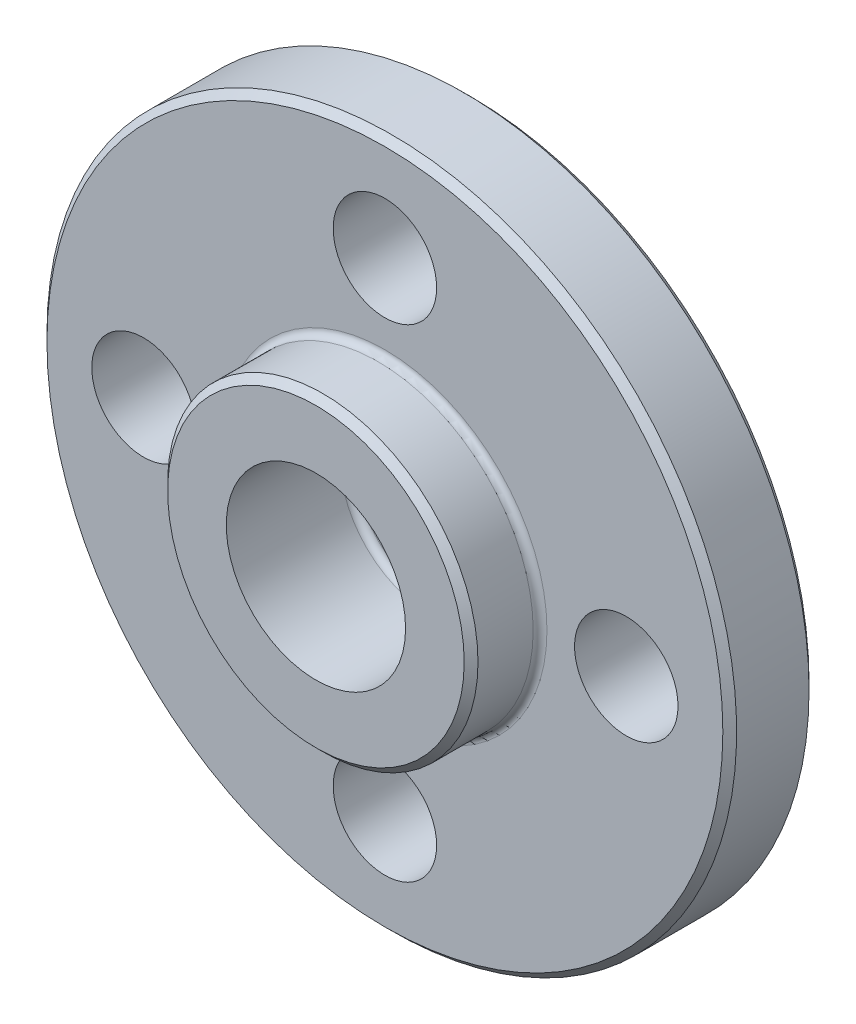
ISO-10303-21;
HEADER;
FILE_DESCRIPTION(('STEP AP214'),'2;1');
FILE_NAME('part.step','',(''),(''),'','','');
FILE_SCHEMA(('AUTOMOTIVE_DESIGN { 1 0 10303 214 1 1 1 1 }'));
ENDSEC;
DATA;
#1=APPLICATION_CONTEXT('core data for automotive mechanical design processes');
#2=APPLICATION_PROTOCOL_DEFINITION('international standard','automotive_design',2000,#1);
#3=PRODUCT_CONTEXT('',#1,'mechanical');
#4=PRODUCT('Part','Part','',(#3));
#5=PRODUCT_RELATED_PRODUCT_CATEGORY('part','',(#4));
#6=PRODUCT_DEFINITION_FORMATION('','',#4);
#7=PRODUCT_DEFINITION_CONTEXT('part definition',#1,'design');
#8=PRODUCT_DEFINITION('design','',#6,#7);
#9=PRODUCT_DEFINITION_SHAPE('','',#8);
#10=(LENGTH_UNIT() NAMED_UNIT(*) SI_UNIT(.MILLI.,.METRE.));
#11=(NAMED_UNIT(*) PLANE_ANGLE_UNIT() SI_UNIT($,.RADIAN.));
#12=(NAMED_UNIT(*) SI_UNIT($,.STERADIAN.) SOLID_ANGLE_UNIT());
#13=UNCERTAINTY_MEASURE_WITH_UNIT(LENGTH_MEASURE(1.E-05),#10,'distance_accuracy_value','');
#14=(GEOMETRIC_REPRESENTATION_CONTEXT(3) GLOBAL_UNCERTAINTY_ASSIGNED_CONTEXT((#13)) GLOBAL_UNIT_ASSIGNED_CONTEXT((#10,
#11,#12)) REPRESENTATION_CONTEXT('',''));
#15=CARTESIAN_POINT('',(0.,0.,0.));
#16=DIRECTION('',(0.,0.,1.));
#17=DIRECTION('',(1.,0.,0.));
#18=AXIS2_PLACEMENT_3D('',#15,#16,#17);
#19=CARTESIAN_POINT('',(0.,0.,2.5));
#20=DIRECTION('',(0.,0.,-1.));
#21=DIRECTION('',(-1.,0.,0.));
#22=AXIS2_PLACEMENT_3D('',#19,#20,#21);
#23=CYLINDRICAL_SURFACE('',#22,1.5);
#24=CARTESIAN_POINT('',(0.,0.,0.));
#25=DIRECTION('',(0.,0.,1.));
#26=DIRECTION('',(1.,0.,0.));
#27=AXIS2_PLACEMENT_3D('',#24,#25,#26);
#28=CIRCLE('',#27,1.5);
#29=CARTESIAN_POINT('',(1.5,0.,0.));
#30=VERTEX_POINT('',#29);
#31=EDGE_CURVE('E74',#30,#30,#28,.T.);
#32=ORIENTED_EDGE('',*,*,#31,.F.);
#33=EDGE_LOOP('',(#32));
#34=FACE_BOUND('',#33,.T.);
#35=CARTESIAN_POINT('',(0.,0.,1.));
#36=DIRECTION('',(0.,0.,1.));
#37=DIRECTION('',(1.,0.,0.));
#38=AXIS2_PLACEMENT_3D('',#35,#36,#37);
#39=CIRCLE('',#38,1.5);
#40=CARTESIAN_POINT('',(1.5,0.,1.));
#41=VERTEX_POINT('',#40);
#42=EDGE_CURVE('E71',#41,#41,#39,.T.);
#43=ORIENTED_EDGE('',*,*,#42,.T.);
#44=EDGE_LOOP('',(#43));
#45=FACE_BOUND('',#44,.T.);
#46=ADVANCED_FACE('F32',(#34,#45),#23,.F.);
#47=CARTESIAN_POINT('',(0.,0.,2.5));
#48=DIRECTION('',(0.,0.,1.));
#49=DIRECTION('',(1.,0.,0.));
#50=AXIS2_PLACEMENT_3D('',#47,#48,#49);
#51=PLANE('',#50);
#52=CARTESIAN_POINT('',(0.,0.,2.5));
#53=DIRECTION('',(0.,0.,1.));
#54=DIRECTION('',(1.,0.,0.));
#55=AXIS2_PLACEMENT_3D('',#52,#53,#54);
#56=CIRCLE('',#55,4.7);
#57=CARTESIAN_POINT('',(4.7,0.,2.5));
#58=VERTEX_POINT('',#57);
#59=EDGE_CURVE('E10',#58,#58,#56,.F.);
#60=ORIENTED_EDGE('',*,*,#59,.T.);
#61=EDGE_LOOP('',(#60));
#62=FACE_BOUND('',#61,.T.);
#63=CARTESIAN_POINT('',(0.,0.,2.5));
#64=DIRECTION('',(0.,0.,1.));
#65=DIRECTION('',(1.,0.,0.));
#66=AXIS2_PLACEMENT_3D('',#63,#64,#65);
#67=CIRCLE('',#66,9.8);
#68=CARTESIAN_POINT('',(-9.8,0.,2.5));
#69=VERTEX_POINT('',#68);
#70=EDGE_CURVE('E52',#69,#69,#67,.T.);
#71=ORIENTED_EDGE('',*,*,#70,.T.);
#72=EDGE_LOOP('',(#71));
#73=FACE_BOUND('',#72,.T.);
#74=CARTESIAN_POINT('',(0.,-7.,2.5));
#75=DIRECTION('',(0.,0.,1.));
#76=DIRECTION('',(1.,0.,0.));
#77=AXIS2_PLACEMENT_3D('',#74,#75,#76);
#78=CIRCLE('',#77,1.5);
#79=CARTESIAN_POINT('',(1.5,-7.,2.5));
#80=VERTEX_POINT('',#79);
#81=EDGE_CURVE('E85',#80,#80,#78,.T.);
#82=ORIENTED_EDGE('',*,*,#81,.F.);
#83=EDGE_LOOP('',(#82));
#84=FACE_BOUND('',#83,.T.);
#85=CARTESIAN_POINT('',(0.,7.,2.5));
#86=DIRECTION('',(0.,0.,1.));
#87=DIRECTION('',(1.,0.,0.));
#88=AXIS2_PLACEMENT_3D('',#85,#86,#87);
#89=CIRCLE('',#88,1.5);
#90=CARTESIAN_POINT('',(1.5,7.,2.5));
#91=VERTEX_POINT('',#90);
#92=EDGE_CURVE('E70',#91,#91,#89,.T.);
#93=ORIENTED_EDGE('',*,*,#92,.F.);
#94=EDGE_LOOP('',(#93));
#95=FACE_BOUND('',#94,.T.);
#96=CARTESIAN_POINT('',(7.,0.,2.5));
#97=DIRECTION('',(0.,0.,1.));
#98=DIRECTION('',(1.,0.,0.));
#99=AXIS2_PLACEMENT_3D('',#96,#97,#98);
#100=CIRCLE('',#99,1.5);
#101=CARTESIAN_POINT('',(8.5,0.,2.5));
#102=VERTEX_POINT('',#101);
#103=EDGE_CURVE('E79',#102,#102,#100,.T.);
#104=ORIENTED_EDGE('',*,*,#103,.F.);
#105=EDGE_LOOP('',(#104));
#106=FACE_BOUND('',#105,.T.);
#107=CARTESIAN_POINT('',(-7.,0.,2.5));
#108=DIRECTION('',(0.,0.,1.));
#109=DIRECTION('',(1.,0.,0.));
#110=AXIS2_PLACEMENT_3D('',#107,#108,#109);
#111=CIRCLE('',#110,1.5);
#112=CARTESIAN_POINT('',(-5.5,0.,2.5));
#113=VERTEX_POINT('',#112);
#114=EDGE_CURVE('E91',#113,#113,#111,.T.);
#115=ORIENTED_EDGE('',*,*,#114,.F.);
#116=EDGE_LOOP('',(#115));
#117=FACE_BOUND('',#116,.T.);
#118=ADVANCED_FACE('F121',(#62,#73,#84,#95,#106,#117),#51,.T.);
#119=CARTESIAN_POINT('',(0.,0.,0.));
#120=DIRECTION('',(0.,0.,1.));
#121=DIRECTION('',(1.,0.,0.));
#122=AXIS2_PLACEMENT_3D('',#119,#120,#121);
#123=PLANE('',#122);
#124=CARTESIAN_POINT('',(0.,0.,0.));
#125=DIRECTION('',(0.,0.,1.));
#126=DIRECTION('',(1.,0.,0.));
#127=AXIS2_PLACEMENT_3D('',#124,#125,#126);
#128=CIRCLE('',#127,9.8);
#129=CARTESIAN_POINT('',(9.8,0.,0.));
#130=VERTEX_POINT('',#129);
#131=EDGE_CURVE('E55',#130,#130,#128,.F.);
#132=ORIENTED_EDGE('',*,*,#131,.T.);
#133=EDGE_LOOP('',(#132));
#134=FACE_BOUND('',#133,.T.);
#135=CARTESIAN_POINT('',(-7.,0.,0.));
#136=DIRECTION('',(0.,0.,1.));
#137=DIRECTION('',(1.,0.,0.));
#138=AXIS2_PLACEMENT_3D('',#135,#136,#137);
#139=CIRCLE('',#138,1.5);
#140=CARTESIAN_POINT('',(-5.5,0.,0.));
#141=VERTEX_POINT('',#140);
#142=EDGE_CURVE('E94',#141,#141,#139,.T.);
#143=ORIENTED_EDGE('',*,*,#142,.T.);
#144=EDGE_LOOP('',(#143));
#145=FACE_BOUND('',#144,.T.);
#146=CARTESIAN_POINT('',(7.,0.,0.));
#147=DIRECTION('',(0.,0.,1.));
#148=DIRECTION('',(1.,0.,0.));
#149=AXIS2_PLACEMENT_3D('',#146,#147,#148);
#150=CIRCLE('',#149,1.5);
#151=CARTESIAN_POINT('',(8.5,0.,0.));
#152=VERTEX_POINT('',#151);
#153=EDGE_CURVE('E82',#152,#152,#150,.T.);
#154=ORIENTED_EDGE('',*,*,#153,.T.);
#155=EDGE_LOOP('',(#154));
#156=FACE_BOUND('',#155,.T.);
#157=CARTESIAN_POINT('',(0.,7.,0.));
#158=DIRECTION('',(0.,0.,1.));
#159=DIRECTION('',(1.,0.,0.));
#160=AXIS2_PLACEMENT_3D('',#157,#158,#159);
#161=CIRCLE('',#160,1.5);
#162=CARTESIAN_POINT('',(1.5,7.,0.));
#163=VERTEX_POINT('',#162);
#164=EDGE_CURVE('E76',#163,#163,#161,.T.);
#165=ORIENTED_EDGE('',*,*,#164,.T.);
#166=EDGE_LOOP('',(#165));
#167=FACE_BOUND('',#166,.T.);
#168=CARTESIAN_POINT('',(0.,-7.,0.));
#169=DIRECTION('',(0.,0.,1.));
#170=DIRECTION('',(1.,0.,0.));
#171=AXIS2_PLACEMENT_3D('',#168,#169,#170);
#172=CIRCLE('',#171,1.5);
#173=CARTESIAN_POINT('',(1.5,-7.,0.));
#174=VERTEX_POINT('',#173);
#175=EDGE_CURVE('E88',#174,#174,#172,.T.);
#176=ORIENTED_EDGE('',*,*,#175,.T.);
#177=EDGE_LOOP('',(#176));
#178=FACE_BOUND('',#177,.T.);
#179=ORIENTED_EDGE('',*,*,#31,.T.);
#180=EDGE_LOOP('',(#179));
#181=FACE_BOUND('',#180,.T.);
#182=ADVANCED_FACE('F127',(#134,#145,#156,#167,#178,#181),#123,.F.);
#183=CARTESIAN_POINT('',(0.,0.,2.5));
#184=DIRECTION('',(0.,0.,-1.));
#185=DIRECTION('',(-1.,0.,0.));
#186=AXIS2_PLACEMENT_3D('',#183,#184,#185);
#187=CYLINDRICAL_SURFACE('',#186,10.);
#188=CARTESIAN_POINT('',(0.,0.,0.200000000000002));
#189=DIRECTION('',(0.,0.,1.));
#190=DIRECTION('',(1.,0.,0.));
#191=AXIS2_PLACEMENT_3D('',#188,#189,#190);
#192=CIRCLE('',#191,10.);
#193=CARTESIAN_POINT('',(10.,0.,0.200000000000002));
#194=VERTEX_POINT('',#193);
#195=EDGE_CURVE('E58',#194,#194,#192,.T.);
#196=ORIENTED_EDGE('',*,*,#195,.T.);
#197=EDGE_LOOP('',(#196));
#198=FACE_BOUND('',#197,.T.);
#199=CARTESIAN_POINT('',(0.,0.,2.30000000000001));
#200=DIRECTION('',(0.,0.,1.));
#201=DIRECTION('',(1.,0.,0.));
#202=AXIS2_PLACEMENT_3D('',#199,#200,#201);
#203=CIRCLE('',#202,10.);
#204=CARTESIAN_POINT('',(-10.,0.,2.30000000000001));
#205=VERTEX_POINT('',#204);
#206=EDGE_CURVE('E61',#205,#205,#203,.F.);
#207=ORIENTED_EDGE('',*,*,#206,.T.);
#208=EDGE_LOOP('',(#207));
#209=FACE_BOUND('',#208,.T.);
#210=ADVANCED_FACE('F145',(#198,#209),#187,.T.);
#211=CARTESIAN_POINT('',(0.,7.,2.5));
#212=DIRECTION('',(0.,0.,-1.));
#213=DIRECTION('',(-1.,0.,0.));
#214=AXIS2_PLACEMENT_3D('',#211,#212,#213);
#215=CYLINDRICAL_SURFACE('',#214,1.5);
#216=ORIENTED_EDGE('',*,*,#92,.T.);
#217=EDGE_LOOP('',(#216));
#218=FACE_BOUND('',#217,.T.);
#219=ORIENTED_EDGE('',*,*,#164,.F.);
#220=EDGE_LOOP('',(#219));
#221=FACE_BOUND('',#220,.T.);
#222=ADVANCED_FACE('F142',(#218,#221),#215,.F.);
#223=CARTESIAN_POINT('',(7.,0.,2.5));
#224=DIRECTION('',(0.,0.,-1.));
#225=DIRECTION('',(-1.,0.,0.));
#226=AXIS2_PLACEMENT_3D('',#223,#224,#225);
#227=CYLINDRICAL_SURFACE('',#226,1.5);
#228=ORIENTED_EDGE('',*,*,#103,.T.);
#229=EDGE_LOOP('',(#228));
#230=FACE_BOUND('',#229,.T.);
#231=ORIENTED_EDGE('',*,*,#153,.F.);
#232=EDGE_LOOP('',(#231));
#233=FACE_BOUND('',#232,.T.);
#234=ADVANCED_FACE('F138',(#230,#233),#227,.F.);
#235=CARTESIAN_POINT('',(0.,-7.,2.5));
#236=DIRECTION('',(0.,0.,-1.));
#237=DIRECTION('',(-1.,0.,0.));
#238=AXIS2_PLACEMENT_3D('',#235,#236,#237);
#239=CYLINDRICAL_SURFACE('',#238,1.5);
#240=ORIENTED_EDGE('',*,*,#81,.T.);
#241=EDGE_LOOP('',(#240));
#242=FACE_BOUND('',#241,.T.);
#243=ORIENTED_EDGE('',*,*,#175,.F.);
#244=EDGE_LOOP('',(#243));
#245=FACE_BOUND('',#244,.T.);
#246=ADVANCED_FACE('F134',(#242,#245),#239,.F.);
#247=CARTESIAN_POINT('',(-7.,0.,2.5));
#248=DIRECTION('',(0.,0.,-1.));
#249=DIRECTION('',(-1.,0.,0.));
#250=AXIS2_PLACEMENT_3D('',#247,#248,#249);
#251=CYLINDRICAL_SURFACE('',#250,1.5);
#252=ORIENTED_EDGE('',*,*,#114,.T.);
#253=EDGE_LOOP('',(#252));
#254=FACE_BOUND('',#253,.T.);
#255=ORIENTED_EDGE('',*,*,#142,.F.);
#256=EDGE_LOOP('',(#255));
#257=FACE_BOUND('',#256,.T.);
#258=ADVANCED_FACE('F118',(#254,#257),#251,.F.);
#259=CARTESIAN_POINT('',(0.,0.,4.5));
#260=DIRECTION('',(0.,0.,-1.));
#261=DIRECTION('',(-1.,0.,0.));
#262=AXIS2_PLACEMENT_3D('',#259,#260,#261);
#263=CYLINDRICAL_SURFACE('',#262,4.5);
#264=CARTESIAN_POINT('',(0.,0.,2.7));
#265=DIRECTION('',(0.,0.,1.));
#266=DIRECTION('',(1.,0.,0.));
#267=AXIS2_PLACEMENT_3D('',#264,#265,#266);
#268=CIRCLE('',#267,4.5);
#269=CARTESIAN_POINT('',(4.5,0.,2.7));
#270=VERTEX_POINT('',#269);
#271=EDGE_CURVE('E39',#270,#270,#268,.T.);
#272=ORIENTED_EDGE('',*,*,#271,.T.);
#273=EDGE_LOOP('',(#272));
#274=FACE_BOUND('',#273,.T.);
#275=CARTESIAN_POINT('',(0.,0.,4.3));
#276=DIRECTION('',(0.,0.,1.));
#277=DIRECTION('',(1.,0.,0.));
#278=AXIS2_PLACEMENT_3D('',#275,#276,#277);
#279=CIRCLE('',#278,4.5);
#280=CARTESIAN_POINT('',(4.5,0.,4.3));
#281=VERTEX_POINT('',#280);
#282=EDGE_CURVE('E64',#281,#281,#279,.F.);
#283=ORIENTED_EDGE('',*,*,#282,.T.);
#284=EDGE_LOOP('',(#283));
#285=FACE_BOUND('',#284,.T.);
#286=ADVANCED_FACE('F108',(#274,#285),#263,.T.);
#287=CARTESIAN_POINT('',(0.,0.,4.5));
#288=DIRECTION('',(0.,0.,1.));
#289=DIRECTION('',(1.,0.,0.));
#290=AXIS2_PLACEMENT_3D('',#287,#288,#289);
#291=PLANE('',#290);
#292=CARTESIAN_POINT('',(0.,0.,4.5));
#293=DIRECTION('',(0.,0.,1.));
#294=DIRECTION('',(1.,0.,0.));
#295=AXIS2_PLACEMENT_3D('',#292,#293,#294);
#296=CIRCLE('',#295,4.3);
#297=CARTESIAN_POINT('',(4.3,0.,4.5));
#298=VERTEX_POINT('',#297);
#299=EDGE_CURVE('E67',#298,#298,#296,.T.);
#300=ORIENTED_EDGE('',*,*,#299,.T.);
#301=EDGE_LOOP('',(#300));
#302=FACE_BOUND('',#301,.T.);
#303=CARTESIAN_POINT('',(0.,0.,4.5));
#304=DIRECTION('',(0.,0.,1.));
#305=DIRECTION('',(1.,0.,0.));
#306=AXIS2_PLACEMENT_3D('',#303,#304,#305);
#307=CIRCLE('',#306,2.6);
#308=CARTESIAN_POINT('',(2.6,0.,4.5));
#309=VERTEX_POINT('',#308);
#310=EDGE_CURVE('E75',#309,#309,#307,.T.);
#311=ORIENTED_EDGE('',*,*,#310,.F.);
#312=EDGE_LOOP('',(#311));
#313=FACE_BOUND('',#312,.T.);
#314=ADVANCED_FACE('F106',(#302,#313),#291,.T.);
#315=CARTESIAN_POINT('',(0.,0.,1.));
#316=DIRECTION('',(0.,0.,1.));
#317=DIRECTION('',(1.,0.,0.));
#318=AXIS2_PLACEMENT_3D('',#315,#316,#317);
#319=CYLINDRICAL_SURFACE('',#318,2.6);
#320=CARTESIAN_POINT('',(0.,0.,1.2));
#321=DIRECTION('',(0.,0.,1.));
#322=DIRECTION('',(1.,0.,0.));
#323=AXIS2_PLACEMENT_3D('',#320,#321,#322);
#324=CIRCLE('',#323,2.6);
#325=CARTESIAN_POINT('',(2.6,0.,1.2));
#326=VERTEX_POINT('',#325);
#327=EDGE_CURVE('E43',#326,#326,#324,.F.);
#328=ORIENTED_EDGE('',*,*,#327,.T.);
#329=EDGE_LOOP('',(#328));
#330=FACE_BOUND('',#329,.T.);
#331=ORIENTED_EDGE('',*,*,#310,.T.);
#332=EDGE_LOOP('',(#331));
#333=FACE_BOUND('',#332,.T.);
#334=ADVANCED_FACE('F104',(#330,#333),#319,.F.);
#335=CARTESIAN_POINT('',(0.,0.,1.));
#336=DIRECTION('',(0.,0.,1.));
#337=DIRECTION('',(1.,0.,0.));
#338=AXIS2_PLACEMENT_3D('',#335,#336,#337);
#339=PLANE('',#338);
#340=CARTESIAN_POINT('',(0.,0.,1.));
#341=DIRECTION('',(0.,0.,1.));
#342=DIRECTION('',(1.,0.,0.));
#343=AXIS2_PLACEMENT_3D('',#340,#341,#342);
#344=CIRCLE('',#343,2.4);
#345=CARTESIAN_POINT('',(2.4,0.,1.));
#346=VERTEX_POINT('',#345);
#347=EDGE_CURVE('E47',#346,#346,#344,.T.);
#348=ORIENTED_EDGE('',*,*,#347,.T.);
#349=EDGE_LOOP('',(#348));
#350=FACE_BOUND('',#349,.T.);
#351=ORIENTED_EDGE('',*,*,#42,.F.);
#352=EDGE_LOOP('',(#351));
#353=FACE_BOUND('',#352,.T.);
#354=ADVANCED_FACE('F115',(#350,#353),#339,.T.);
#355=CARTESIAN_POINT('',(0.,0.,4.5));
#356=DIRECTION('',(0.,0.,-1.));
#357=DIRECTION('',(-1.,0.,0.));
#358=AXIS2_PLACEMENT_3D('',#355,#356,#357);
#359=CONICAL_SURFACE('',#358,4.3,0.785398163397448);
#360=ORIENTED_EDGE('',*,*,#282,.F.);
#361=EDGE_LOOP('',(#360));
#362=FACE_BOUND('',#361,.T.);
#363=ORIENTED_EDGE('',*,*,#299,.F.);
#364=EDGE_LOOP('',(#363));
#365=FACE_BOUND('',#364,.T.);
#366=ADVANCED_FACE('F154',(#362,#365),#359,.T.);
#367=CARTESIAN_POINT('',(0.,0.,0.200000000000002));
#368=DIRECTION('',(0.,0.,1.));
#369=DIRECTION('',(1.,0.,0.));
#370=AXIS2_PLACEMENT_3D('',#367,#368,#369);
#371=CONICAL_SURFACE('',#370,10.,0.785398163397453);
#372=ORIENTED_EDGE('',*,*,#131,.F.);
#373=EDGE_LOOP('',(#372));
#374=FACE_BOUND('',#373,.T.);
#375=ORIENTED_EDGE('',*,*,#195,.F.);
#376=EDGE_LOOP('',(#375));
#377=FACE_BOUND('',#376,.T.);
#378=ADVANCED_FACE('F157',(#374,#377),#371,.T.);
#379=CARTESIAN_POINT('',(0.,0.,2.5));
#380=DIRECTION('',(0.,0.,-1.));
#381=DIRECTION('',(-1.,0.,0.));
#382=AXIS2_PLACEMENT_3D('',#379,#380,#381);
#383=CONICAL_SURFACE('',#382,9.8,0.785398163397457);
#384=CARTESIAN_POINT('',(-10.,0.,2.30000000000001));
#385=CARTESIAN_POINT('',(-9.99791666666667,0.,2.30208333333334));
#386=CARTESIAN_POINT('',(-9.99583333333333,0.,2.30416666666667));
#387=CARTESIAN_POINT('',(-9.99166666666667,0.,2.30833333333334));
#388=CARTESIAN_POINT('',(-9.98958333333333,0.,2.31041666666667));
#389=CARTESIAN_POINT('',(-9.98541666666667,0.,2.31458333333334));
#390=CARTESIAN_POINT('',(-9.98333333333333,0.,2.31666666666667));
#391=CARTESIAN_POINT('',(-9.97916666666667,0.,2.32083333333334));
#392=CARTESIAN_POINT('',(-9.97708333333333,0.,2.32291666666667));
#393=CARTESIAN_POINT('',(-9.97291666666667,0.,2.32708333333334));
#394=CARTESIAN_POINT('',(-9.97083333333333,0.,2.32916666666667));
#395=CARTESIAN_POINT('',(-9.96666666666667,0.,2.33333333333334));
#396=CARTESIAN_POINT('',(-9.96458333333333,0.,2.33541666666667));
#397=CARTESIAN_POINT('',(-9.96041666666667,0.,2.33958333333334));
#398=CARTESIAN_POINT('',(-9.95833333333333,0.,2.34166666666667));
#399=CARTESIAN_POINT('',(-9.95416666666667,0.,2.34583333333334));
#400=CARTESIAN_POINT('',(-9.95208333333333,0.,2.34791666666667));
#401=CARTESIAN_POINT('',(-9.94791666666667,0.,2.35208333333334));
#402=CARTESIAN_POINT('',(-9.94583333333333,0.,2.35416666666667));
#403=CARTESIAN_POINT('',(-9.94166666666667,0.,2.35833333333334));
#404=CARTESIAN_POINT('',(-9.93958333333333,0.,2.36041666666667));
#405=CARTESIAN_POINT('',(-9.93541666666667,0.,2.36458333333334));
#406=CARTESIAN_POINT('',(-9.93333333333333,0.,2.36666666666667));
#407=CARTESIAN_POINT('',(-9.92916666666667,0.,2.37083333333334));
#408=CARTESIAN_POINT('',(-9.92708333333333,0.,2.37291666666667));
#409=CARTESIAN_POINT('',(-9.92291666666667,0.,2.37708333333334));
#410=CARTESIAN_POINT('',(-9.92083333333334,0.,2.37916666666667));
#411=CARTESIAN_POINT('',(-9.91666666666667,0.,2.38333333333334));
#412=CARTESIAN_POINT('',(-9.91458333333333,0.,2.38541666666667));
#413=CARTESIAN_POINT('',(-9.91041666666667,0.,2.38958333333334));
#414=CARTESIAN_POINT('',(-9.90833333333333,0.,2.39166666666667));
#415=CARTESIAN_POINT('',(-9.90416666666667,0.,2.39583333333334));
#416=CARTESIAN_POINT('',(-9.90208333333334,0.,2.39791666666667));
#417=CARTESIAN_POINT('',(-9.89791666666667,0.,2.40208333333334));
#418=CARTESIAN_POINT('',(-9.89583333333333,0.,2.40416666666667));
#419=CARTESIAN_POINT('',(-9.89166666666667,0.,2.40833333333334));
#420=CARTESIAN_POINT('',(-9.88958333333334,0.,2.41041666666667));
#421=CARTESIAN_POINT('',(-9.88541666666667,0.,2.41458333333334));
#422=CARTESIAN_POINT('',(-9.88333333333334,0.,2.41666666666667));
#423=CARTESIAN_POINT('',(-9.87916666666667,0.,2.42083333333334));
#424=CARTESIAN_POINT('',(-9.87708333333333,0.,2.42291666666667));
#425=CARTESIAN_POINT('',(-9.87291666666667,0.,2.42708333333334));
#426=CARTESIAN_POINT('',(-9.87083333333334,0.,2.42916666666667));
#427=CARTESIAN_POINT('',(-9.86666666666667,0.,2.43333333333334));
#428=CARTESIAN_POINT('',(-9.86458333333334,0.,2.43541666666667));
#429=CARTESIAN_POINT('',(-9.86041666666667,0.,2.43958333333334));
#430=CARTESIAN_POINT('',(-9.85833333333334,0.,2.44166666666667));
#431=CARTESIAN_POINT('',(-9.85416666666667,0.,2.44583333333333));
#432=CARTESIAN_POINT('',(-9.85208333333334,0.,2.44791666666667));
#433=CARTESIAN_POINT('',(-9.84791666666667,0.,2.45208333333334));
#434=CARTESIAN_POINT('',(-9.84583333333334,0.,2.45416666666667));
#435=CARTESIAN_POINT('',(-9.84166666666667,0.,2.45833333333333));
#436=CARTESIAN_POINT('',(-9.83958333333334,0.,2.46041666666667));
#437=CARTESIAN_POINT('',(-9.83541666666667,0.,2.46458333333333));
#438=CARTESIAN_POINT('',(-9.83333333333334,0.,2.46666666666667));
#439=CARTESIAN_POINT('',(-9.82916666666667,0.,2.47083333333333));
#440=CARTESIAN_POINT('',(-9.82708333333334,0.,2.47291666666667));
#441=CARTESIAN_POINT('',(-9.82291666666667,0.,2.47708333333333));
#442=CARTESIAN_POINT('',(-9.82083333333334,0.,2.47916666666667));
#443=CARTESIAN_POINT('',(-9.81666666666667,0.,2.48333333333333));
#444=CARTESIAN_POINT('',(-9.81458333333334,0.,2.48541666666667));
#445=CARTESIAN_POINT('',(-9.81041666666667,0.,2.48958333333333));
#446=CARTESIAN_POINT('',(-9.80833333333334,0.,2.49166666666667));
#447=CARTESIAN_POINT('',(-9.80416666666667,0.,2.49583333333333));
#448=CARTESIAN_POINT('',(-9.80208333333334,0.,2.49791666666667));
#449=CARTESIAN_POINT('',(-9.8,0.,2.5));
#450=B_SPLINE_CURVE_WITH_KNOTS('',3,(#384,#385,#386,#387,#388,#389,#390,#391,#392,#393,#394,
#395,#396,#397,#398,#399,#400,#401,#402,#403,#404,#405,#406,#407,#408,#409,#410,#411,#412,#413,
#414,#415,#416,#417,#418,#419,#420,#421,#422,#423,#424,#425,#426,#427,#428,#429,#430,#431,#432,
#433,#434,#435,#436,#437,#438,#439,#440,#441,#442,#443,#444,#445,#446,#447,#448,#449),
.UNSPECIFIED.,.F.,.F.,(4,2,2,2,2,2,2,2,2,2,2,2,2,2,2,2,2,2,2,2,2,2,2,2,2,2,2,2,2,2,2,2,4),(0.,
0.00883883476483118,0.0176776695296636,0.0265165042944948,0.0353553390593259,0.0441941738241583,
0.0530330085889895,0.0618718433538207,0.0707106781186534,0.0795495128834846,0.0883883476483158,
0.0972271824131482,0.106066017177979,0.114904851942811,0.123743686707643,0.132582521472474,
0.141421356237306,0.150260191002138,0.159099025766969,0.1679378605318,0.176776695296633,
0.185615530061464,0.194454364826295,0.203293199591127,0.212132034355959,0.22097086912079,
0.229809703885623,0.238648538650454,0.247487373415285,0.256326208180117,0.265165042944948,
0.274003877709781,0.282842712474612),.UNSPECIFIED.);
#451=EDGE_CURVE('BSEAM161',#205,#69,#450,.T.);
#452=ORIENTED_EDGE('',*,*,#206,.F.);
#453=ORIENTED_EDGE('',*,*,#70,.F.);
#454=ORIENTED_EDGE('',*,*,#451,.T.);
#455=ORIENTED_EDGE('',*,*,#451,.F.);
#456=EDGE_LOOP('',(#452,#454,#453,#455));
#457=FACE_BOUND('',#456,.T.);
#458=ADVANCED_FACE('F161',(#457),#383,.T.);
#459=CARTESIAN_POINT('',(0.,0.,1.2));
#460=DIRECTION('',(0.,0.,1.));
#461=DIRECTION('',(1.,0.,0.));
#462=AXIS2_PLACEMENT_3D('',#459,#460,#461);
#463=TOROIDAL_SURFACE('',#462,2.4,0.2);
#464=ORIENTED_EDGE('',*,*,#327,.F.);
#465=EDGE_LOOP('',(#464));
#466=FACE_BOUND('',#465,.T.);
#467=ORIENTED_EDGE('',*,*,#347,.F.);
#468=EDGE_LOOP('',(#467));
#469=FACE_BOUND('',#468,.T.);
#470=ADVANCED_FACE('F164',(#466,#469),#463,.F.);
#471=CARTESIAN_POINT('',(0.,0.,2.7));
#472=DIRECTION('',(0.,0.,1.));
#473=DIRECTION('',(1.,0.,0.));
#474=AXIS2_PLACEMENT_3D('',#471,#472,#473);
#475=TOROIDAL_SURFACE('',#474,4.7,0.2);
#476=ORIENTED_EDGE('',*,*,#59,.F.);
#477=EDGE_LOOP('',(#476));
#478=FACE_BOUND('',#477,.T.);
#479=ORIENTED_EDGE('',*,*,#271,.F.);
#480=EDGE_LOOP('',(#479));
#481=FACE_BOUND('',#480,.T.);
#482=ADVANCED_FACE('F34',(#478,#481),#475,.F.);
#483=CLOSED_SHELL('',(#46,#118,#182,#210,#222,#234,#246,#258,#286,#314,#334,#354,#366,#378,#458,
#470,#482));
#484=MANIFOLD_SOLID_BREP('B2',#483);
#485=ADVANCED_BREP_SHAPE_REPRESENTATION('',(#18,#484),#14);
#486=SHAPE_DEFINITION_REPRESENTATION(#9,#485);
ENDSEC;
END-ISO-10303-21;
